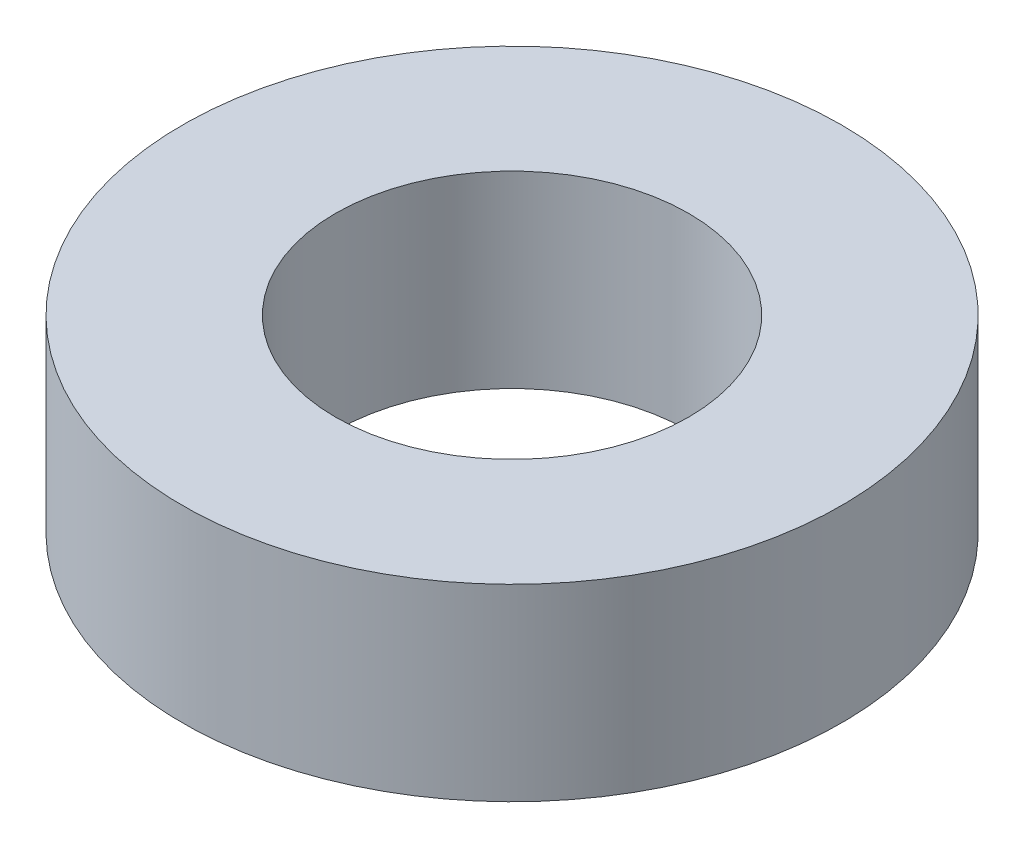
ISO-10303-21;
HEADER;
FILE_DESCRIPTION(('STEP AP214'),'2;1');
FILE_NAME('part.step','',(''),(''),'','','');
FILE_SCHEMA(('AUTOMOTIVE_DESIGN { 1 0 10303 214 1 1 1 1 }'));
ENDSEC;
DATA;
#1=APPLICATION_CONTEXT('core data for automotive mechanical design processes');
#2=APPLICATION_PROTOCOL_DEFINITION('international standard','automotive_design',2000,#1);
#3=PRODUCT_CONTEXT('',#1,'mechanical');
#4=PRODUCT('Part','Part','',(#3));
#5=PRODUCT_RELATED_PRODUCT_CATEGORY('part','',(#4));
#6=PRODUCT_DEFINITION_FORMATION('','',#4);
#7=PRODUCT_DEFINITION_CONTEXT('part definition',#1,'design');
#8=PRODUCT_DEFINITION('design','',#6,#7);
#9=PRODUCT_DEFINITION_SHAPE('','',#8);
#10=(LENGTH_UNIT() NAMED_UNIT(*) SI_UNIT(.MILLI.,.METRE.));
#11=(NAMED_UNIT(*) PLANE_ANGLE_UNIT() SI_UNIT($,.RADIAN.));
#12=(NAMED_UNIT(*) SI_UNIT($,.STERADIAN.) SOLID_ANGLE_UNIT());
#13=UNCERTAINTY_MEASURE_WITH_UNIT(LENGTH_MEASURE(1.E-05),#10,'distance_accuracy_value','');
#14=(GEOMETRIC_REPRESENTATION_CONTEXT(3) GLOBAL_UNCERTAINTY_ASSIGNED_CONTEXT((#13)) GLOBAL_UNIT_ASSIGNED_CONTEXT((#10,
#11,#12)) REPRESENTATION_CONTEXT('',''));
#15=CARTESIAN_POINT('',(0.,0.,0.));
#16=DIRECTION('',(0.,0.,1.));
#17=DIRECTION('',(1.,0.,0.));
#18=AXIS2_PLACEMENT_3D('',#15,#16,#17);
#19=CARTESIAN_POINT('',(0.,-5.68139205947173,0.));
#20=DIRECTION('',(0.,-1.,0.));
#21=DIRECTION('',(0.,0.,-1.));
#22=AXIS2_PLACEMENT_3D('',#19,#20,#21);
#23=CYLINDRICAL_SURFACE('',#22,7.5);
#24=CARTESIAN_POINT('',(0.,0.,0.));
#25=DIRECTION('',(0.,-1.,0.));
#26=DIRECTION('',(0.,0.,-1.));
#27=AXIS2_PLACEMENT_3D('',#24,#25,#26);
#28=CIRCLE('',#27,7.5);
#29=CARTESIAN_POINT('',(0.,0.,-7.5));
#30=VERTEX_POINT('',#29);
#31=EDGE_CURVE('E51',#30,#30,#28,.T.);
#32=ORIENTED_EDGE('',*,*,#31,.T.);
#33=EDGE_LOOP('',(#32));
#34=FACE_BOUND('',#33,.T.);
#35=CARTESIAN_POINT('',(0.,8.,0.));
#36=DIRECTION('',(0.,-1.,0.));
#37=DIRECTION('',(0.,0.,-1.));
#38=AXIS2_PLACEMENT_3D('',#35,#36,#37);
#39=CIRCLE('',#38,7.5);
#40=CARTESIAN_POINT('',(0.,8.,-7.5));
#41=VERTEX_POINT('',#40);
#42=EDGE_CURVE('E10',#41,#41,#39,.T.);
#43=ORIENTED_EDGE('',*,*,#42,.F.);
#44=EDGE_LOOP('',(#43));
#45=FACE_BOUND('',#44,.T.);
#46=ADVANCED_FACE('F37',(#34,#45),#23,.F.);
#47=CARTESIAN_POINT('',(7.5,8.,0.));
#48=DIRECTION('',(0.,1.,0.));
#49=DIRECTION('',(0.,0.,1.));
#50=AXIS2_PLACEMENT_3D('',#47,#48,#49);
#51=PLANE('',#50);
#52=ORIENTED_EDGE('',*,*,#42,.T.);
#53=EDGE_LOOP('',(#52));
#54=FACE_BOUND('',#53,.T.);
#55=CARTESIAN_POINT('',(0.,8.,0.));
#56=DIRECTION('',(0.,-1.,0.));
#57=DIRECTION('',(0.,0.,-1.));
#58=AXIS2_PLACEMENT_3D('',#55,#56,#57);
#59=CIRCLE('',#58,14.);
#60=CARTESIAN_POINT('',(0.,8.,-14.));
#61=VERTEX_POINT('',#60);
#62=EDGE_CURVE('E43',#61,#61,#59,.T.);
#63=ORIENTED_EDGE('',*,*,#62,.F.);
#64=EDGE_LOOP('',(#63));
#65=FACE_BOUND('',#64,.T.);
#66=ADVANCED_FACE('F67',(#54,#65),#51,.T.);
#67=CARTESIAN_POINT('',(0.,-5.68139205947173,0.));
#68=DIRECTION('',(0.,-1.,0.));
#69=DIRECTION('',(0.,0.,-1.));
#70=AXIS2_PLACEMENT_3D('',#67,#68,#69);
#71=CYLINDRICAL_SURFACE('',#70,14.);
#72=ORIENTED_EDGE('',*,*,#62,.T.);
#73=EDGE_LOOP('',(#72));
#74=FACE_BOUND('',#73,.T.);
#75=CARTESIAN_POINT('',(0.,0.,0.));
#76=DIRECTION('',(0.,-1.,0.));
#77=DIRECTION('',(0.,0.,-1.));
#78=AXIS2_PLACEMENT_3D('',#75,#76,#77);
#79=CIRCLE('',#78,14.);
#80=CARTESIAN_POINT('',(0.,0.,-14.));
#81=VERTEX_POINT('',#80);
#82=EDGE_CURVE('E47',#81,#81,#79,.T.);
#83=ORIENTED_EDGE('',*,*,#82,.F.);
#84=EDGE_LOOP('',(#83));
#85=FACE_BOUND('',#84,.T.);
#86=ADVANCED_FACE('F61',(#74,#85),#71,.T.);
#87=CARTESIAN_POINT('',(7.5,0.,0.));
#88=DIRECTION('',(0.,-1.,0.));
#89=DIRECTION('',(0.,0.,-1.));
#90=AXIS2_PLACEMENT_3D('',#87,#88,#89);
#91=PLANE('',#90);
#92=ORIENTED_EDGE('',*,*,#82,.T.);
#93=EDGE_LOOP('',(#92));
#94=FACE_BOUND('',#93,.T.);
#95=ORIENTED_EDGE('',*,*,#31,.F.);
#96=EDGE_LOOP('',(#95));
#97=FACE_BOUND('',#96,.T.);
#98=ADVANCED_FACE('F59',(#94,#97),#91,.T.);
#99=CLOSED_SHELL('',(#46,#66,#86,#98));
#100=MANIFOLD_SOLID_BREP('B2',#99);
#101=ADVANCED_BREP_SHAPE_REPRESENTATION('',(#18,#100),#14);
#102=SHAPE_DEFINITION_REPRESENTATION(#9,#101);
ENDSEC;
END-ISO-10303-21;
